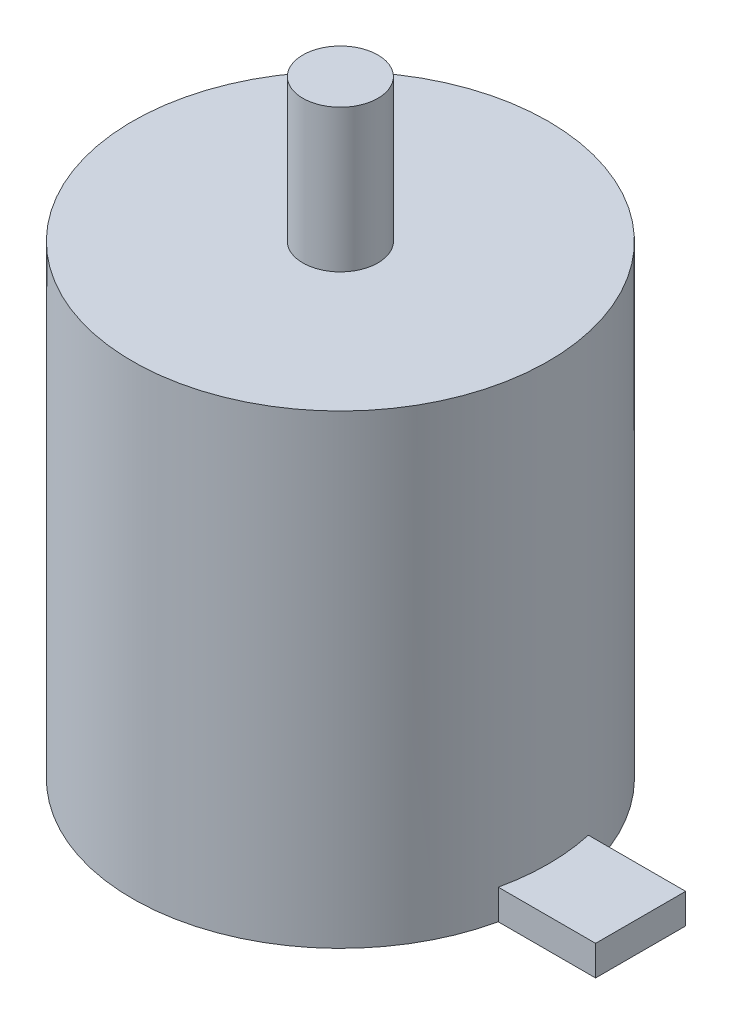
ISO-10303-21;
HEADER;
FILE_DESCRIPTION(('STEP AP214'),'2;1');
FILE_NAME('part.step','',(''),(''),'','','');
FILE_SCHEMA(('AUTOMOTIVE_DESIGN { 1 0 10303 214 1 1 1 1 }'));
ENDSEC;
DATA;
#1=APPLICATION_CONTEXT('core data for automotive mechanical design processes');
#2=APPLICATION_PROTOCOL_DEFINITION('international standard','automotive_design',2000,#1);
#3=PRODUCT_CONTEXT('',#1,'mechanical');
#4=PRODUCT('Part','Part','',(#3));
#5=PRODUCT_RELATED_PRODUCT_CATEGORY('part','',(#4));
#6=PRODUCT_DEFINITION_FORMATION('','',#4);
#7=PRODUCT_DEFINITION_CONTEXT('part definition',#1,'design');
#8=PRODUCT_DEFINITION('design','',#6,#7);
#9=PRODUCT_DEFINITION_SHAPE('','',#8);
#10=(LENGTH_UNIT() NAMED_UNIT(*) SI_UNIT(.MILLI.,.METRE.));
#11=(NAMED_UNIT(*) PLANE_ANGLE_UNIT() SI_UNIT($,.RADIAN.));
#12=(NAMED_UNIT(*) SI_UNIT($,.STERADIAN.) SOLID_ANGLE_UNIT());
#13=UNCERTAINTY_MEASURE_WITH_UNIT(LENGTH_MEASURE(1.E-05),#10,'distance_accuracy_value','');
#14=(GEOMETRIC_REPRESENTATION_CONTEXT(3) GLOBAL_UNCERTAINTY_ASSIGNED_CONTEXT((#13)) GLOBAL_UNIT_ASSIGNED_CONTEXT((#10,
#11,#12)) REPRESENTATION_CONTEXT('',''));
#15=CARTESIAN_POINT('',(0.,0.,0.));
#16=DIRECTION('',(0.,0.,1.));
#17=DIRECTION('',(1.,0.,0.));
#18=AXIS2_PLACEMENT_3D('',#15,#16,#17);
#19=CARTESIAN_POINT('',(0.,-2.,0.));
#20=DIRECTION('',(0.,-1.,0.));
#21=DIRECTION('',(0.,0.,-1.));
#22=AXIS2_PLACEMENT_3D('',#19,#20,#21);
#23=PLANE('',#22);
#24=CARTESIAN_POINT('',(0.,-2.,0.));
#25=DIRECTION('',(0.,-1.,0.));
#26=DIRECTION('',(0.,0.,-1.));
#27=AXIS2_PLACEMENT_3D('',#24,#25,#26);
#28=CIRCLE('',#27,1.5);
#29=CARTESIAN_POINT('',(0.,-2.,-1.5));
#30=VERTEX_POINT('',#29);
#31=EDGE_CURVE('E11',#30,#30,#28,.T.);
#32=ORIENTED_EDGE('',*,*,#31,.T.);
#33=EDGE_LOOP('',(#32));
#34=FACE_BOUND('',#33,.T.);
#35=ADVANCED_FACE('F45',(#34),#23,.T.);
#36=CARTESIAN_POINT('',(0.,0.,0.));
#37=DIRECTION('',(0.,-1.,0.));
#38=DIRECTION('',(0.,0.,-1.));
#39=AXIS2_PLACEMENT_3D('',#36,#37,#38);
#40=CYLINDRICAL_SURFACE('',#39,1.5);
#41=CARTESIAN_POINT('',(0.,0.,0.));
#42=DIRECTION('',(0.,-1.,0.));
#43=DIRECTION('',(0.,0.,-1.));
#44=AXIS2_PLACEMENT_3D('',#41,#42,#43);
#45=CIRCLE('',#44,1.5);
#46=CARTESIAN_POINT('',(0.,0.,-1.5));
#47=VERTEX_POINT('',#46);
#48=EDGE_CURVE('E53',#47,#47,#45,.T.);
#49=ORIENTED_EDGE('',*,*,#48,.T.);
#50=EDGE_LOOP('',(#49));
#51=FACE_BOUND('',#50,.T.);
#52=ORIENTED_EDGE('',*,*,#31,.F.);
#53=EDGE_LOOP('',(#52));
#54=FACE_BOUND('',#53,.T.);
#55=ADVANCED_FACE('F182',(#51,#54),#40,.T.);
#56=CARTESIAN_POINT('',(0.,0.,-1.5));
#57=DIRECTION('',(0.,-1.,0.));
#58=DIRECTION('',(0.,0.,-1.));
#59=AXIS2_PLACEMENT_3D('',#56,#57,#58);
#60=PLANE('',#59);
#61=CARTESIAN_POINT('',(6.7175144212722,0.,-6.7175144212722));
#62=DIRECTION('',(0.,-1.,0.));
#63=DIRECTION('',(0.,0.,-1.));
#64=AXIS2_PLACEMENT_3D('',#61,#62,#63);
#65=CIRCLE('',#64,1.25);
#66=CARTESIAN_POINT('',(6.7175144212722,0.,-7.9675144212722));
#67=VERTEX_POINT('',#66);
#68=EDGE_CURVE('E141',#67,#67,#65,.T.);
#69=ORIENTED_EDGE('',*,*,#68,.F.);
#70=EDGE_LOOP('',(#69));
#71=FACE_BOUND('',#70,.T.);
#72=CARTESIAN_POINT('',(-6.7175144212722,0.,6.7175144212722));
#73=DIRECTION('',(0.,-1.,0.));
#74=DIRECTION('',(0.,0.,1.));
#75=AXIS2_PLACEMENT_3D('',#72,#73,#74);
#76=CIRCLE('',#75,1.25);
#77=CARTESIAN_POINT('',(-6.7175144212722,0.,7.9675144212722));
#78=VERTEX_POINT('',#77);
#79=EDGE_CURVE('E150',#78,#78,#76,.T.);
#80=ORIENTED_EDGE('',*,*,#79,.F.);
#81=EDGE_LOOP('',(#80));
#82=FACE_BOUND('',#81,.T.);
#83=CARTESIAN_POINT('',(-5.65685424974619,0.,-5.65685424974618));
#84=DIRECTION('',(0.,-1.,0.));
#85=DIRECTION('',(0.,0.,1.));
#86=AXIS2_PLACEMENT_3D('',#83,#84,#85);
#87=CIRCLE('',#86,1.25);
#88=CARTESIAN_POINT('',(-5.65685424974619,0.,-4.40685424974618));
#89=VERTEX_POINT('',#88);
#90=EDGE_CURVE('E133',#89,#89,#87,.T.);
#91=ORIENTED_EDGE('',*,*,#90,.F.);
#92=EDGE_LOOP('',(#91));
#93=FACE_BOUND('',#92,.T.);
#94=CARTESIAN_POINT('',(5.65685424974619,0.,5.65685424974619));
#95=DIRECTION('',(0.,-1.,0.));
#96=DIRECTION('',(0.,0.,-1.));
#97=AXIS2_PLACEMENT_3D('',#94,#95,#96);
#98=CIRCLE('',#97,1.25);
#99=CARTESIAN_POINT('',(5.65685424974619,0.,4.40685424974619));
#100=VERTEX_POINT('',#99);
#101=EDGE_CURVE('E145',#100,#100,#98,.T.);
#102=ORIENTED_EDGE('',*,*,#101,.F.);
#103=EDGE_LOOP('',(#102));
#104=FACE_BOUND('',#103,.T.);
#105=CARTESIAN_POINT('',(0.,0.,0.));
#106=DIRECTION('',(0.,-1.,0.));
#107=DIRECTION('',(0.,0.,-1.));
#108=AXIS2_PLACEMENT_3D('',#105,#106,#107);
#109=CIRCLE('',#108,13.85);
#110=CARTESIAN_POINT('',(13.5211870780638,0.,3.));
#111=VERTEX_POINT('',#110);
#112=CARTESIAN_POINT('',(13.5211870780638,0.,-3.));
#113=VERTEX_POINT('',#112);
#114=EDGE_CURVE('E176',#111,#113,#109,.T.);
#115=ORIENTED_EDGE('',*,*,#114,.T.);
#116=DIRECTION('',(1.,0.,0.));
#117=VECTOR('',#116,1.);
#118=CARTESIAN_POINT('',(0.,0.,-3.));
#119=LINE('',#118,#117);
#120=CARTESIAN_POINT('',(20.,0.,-3.));
#121=VERTEX_POINT('',#120);
#122=EDGE_CURVE('E84',#113,#121,#119,.T.);
#123=ORIENTED_EDGE('',*,*,#122,.T.);
#124=DIRECTION('',(0.,0.,1.));
#125=VECTOR('',#124,1.);
#126=CARTESIAN_POINT('',(20.,0.,0.));
#127=LINE('',#126,#125);
#128=CARTESIAN_POINT('',(20.,0.,3.));
#129=VERTEX_POINT('',#128);
#130=EDGE_CURVE('E121',#121,#129,#127,.T.);
#131=ORIENTED_EDGE('',*,*,#130,.T.);
#132=DIRECTION('',(1.,0.,0.));
#133=VECTOR('',#132,1.);
#134=CARTESIAN_POINT('',(0.,0.,3.));
#135=LINE('',#134,#133);
#136=EDGE_CURVE('E60',#111,#129,#135,.T.);
#137=ORIENTED_EDGE('',*,*,#136,.F.);
#138=EDGE_LOOP('',(#115,#123,#131,#137));
#139=FACE_BOUND('',#138,.T.);
#140=ORIENTED_EDGE('',*,*,#48,.F.);
#141=EDGE_LOOP('',(#140));
#142=FACE_BOUND('',#141,.T.);
#143=ADVANCED_FACE('F185',(#71,#82,#93,#104,#139,#142),#60,.T.);
#144=CARTESIAN_POINT('',(0.,0.,0.));
#145=DIRECTION('',(0.,-1.,0.));
#146=DIRECTION('',(0.,0.,-1.));
#147=AXIS2_PLACEMENT_3D('',#144,#145,#146);
#148=CYLINDRICAL_SURFACE('',#147,13.85);
#149=DIRECTION('',(0.,-1.,0.));
#150=VECTOR('',#149,1.);
#151=CARTESIAN_POINT('',(13.5211870780638,2.,-3.));
#152=LINE('',#151,#150);
#153=CARTESIAN_POINT('',(13.5211870780638,2.,-3.));
#154=VERTEX_POINT('',#153);
#155=EDGE_CURVE('E69',#154,#113,#152,.T.);
#156=ORIENTED_EDGE('',*,*,#155,.T.);
#157=ORIENTED_EDGE('',*,*,#114,.F.);
#158=DIRECTION('',(0.,-1.,0.));
#159=VECTOR('',#158,1.);
#160=CARTESIAN_POINT('',(13.5211870780638,2.,3.));
#161=LINE('',#160,#159);
#162=CARTESIAN_POINT('',(13.5211870780638,2.,3.));
#163=VERTEX_POINT('',#162);
#164=EDGE_CURVE('E108',#163,#111,#161,.T.);
#165=ORIENTED_EDGE('',*,*,#164,.F.);
#166=CARTESIAN_POINT('',(0.,2.,0.));
#167=DIRECTION('',(0.,-1.,0.));
#168=DIRECTION('',(0.,0.,-1.));
#169=AXIS2_PLACEMENT_3D('',#166,#167,#168);
#170=CIRCLE('',#169,13.85);
#171=EDGE_CURVE('E100',#154,#163,#170,.T.);
#172=ORIENTED_EDGE('',*,*,#171,.F.);
#173=EDGE_LOOP('',(#156,#157,#165,#172));
#174=FACE_BOUND('',#173,.T.);
#175=CARTESIAN_POINT('',(0.,31.,0.));
#176=DIRECTION('',(0.,-1.,0.));
#177=DIRECTION('',(0.,0.,-1.));
#178=AXIS2_PLACEMENT_3D('',#175,#176,#177);
#179=CIRCLE('',#178,13.85);
#180=CARTESIAN_POINT('',(0.,31.,-13.85));
#181=VERTEX_POINT('',#180);
#182=EDGE_CURVE('E172',#181,#181,#179,.T.);
#183=ORIENTED_EDGE('',*,*,#182,.T.);
#184=EDGE_LOOP('',(#183));
#185=FACE_BOUND('',#184,.T.);
#186=ADVANCED_FACE('F187',(#174,#185),#148,.T.);
#187=CARTESIAN_POINT('',(0.,31.,-2.5));
#188=DIRECTION('',(0.,1.,0.));
#189=DIRECTION('',(0.,0.,1.));
#190=AXIS2_PLACEMENT_3D('',#187,#188,#189);
#191=PLANE('',#190);
#192=CARTESIAN_POINT('',(0.,31.,0.));
#193=DIRECTION('',(0.,-1.,0.));
#194=DIRECTION('',(0.,0.,-1.));
#195=AXIS2_PLACEMENT_3D('',#192,#193,#194);
#196=CIRCLE('',#195,2.5);
#197=CARTESIAN_POINT('',(0.,31.,-2.5));
#198=VERTEX_POINT('',#197);
#199=EDGE_CURVE('E168',#198,#198,#196,.T.);
#200=ORIENTED_EDGE('',*,*,#199,.T.);
#201=EDGE_LOOP('',(#200));
#202=FACE_BOUND('',#201,.T.);
#203=ORIENTED_EDGE('',*,*,#182,.F.);
#204=EDGE_LOOP('',(#203));
#205=FACE_BOUND('',#204,.T.);
#206=ADVANCED_FACE('F195',(#202,#205),#191,.T.);
#207=CARTESIAN_POINT('',(0.,0.,0.));
#208=DIRECTION('',(0.,-1.,0.));
#209=DIRECTION('',(0.,0.,-1.));
#210=AXIS2_PLACEMENT_3D('',#207,#208,#209);
#211=CYLINDRICAL_SURFACE('',#210,2.5);
#212=CARTESIAN_POINT('',(0.,40.5,0.));
#213=DIRECTION('',(0.,-1.,0.));
#214=DIRECTION('',(0.,0.,-1.));
#215=AXIS2_PLACEMENT_3D('',#212,#213,#214);
#216=CIRCLE('',#215,2.5);
#217=CARTESIAN_POINT('',(0.,40.5,-2.5));
#218=VERTEX_POINT('',#217);
#219=EDGE_CURVE('E161',#218,#218,#216,.T.);
#220=ORIENTED_EDGE('',*,*,#219,.T.);
#221=EDGE_LOOP('',(#220));
#222=FACE_BOUND('',#221,.T.);
#223=ORIENTED_EDGE('',*,*,#199,.F.);
#224=EDGE_LOOP('',(#223));
#225=FACE_BOUND('',#224,.T.);
#226=ADVANCED_FACE('F226',(#222,#225),#211,.T.);
#227=CARTESIAN_POINT('',(0.,40.5,0.));
#228=DIRECTION('',(0.,1.,0.));
#229=DIRECTION('',(0.,0.,1.));
#230=AXIS2_PLACEMENT_3D('',#227,#228,#229);
#231=PLANE('',#230);
#232=ORIENTED_EDGE('',*,*,#219,.F.);
#233=EDGE_LOOP('',(#232));
#234=FACE_BOUND('',#233,.T.);
#235=ADVANCED_FACE('F233',(#234),#231,.T.);
#236=CARTESIAN_POINT('',(5.65685424974619,5.,5.65685424974619));
#237=DIRECTION('',(0.,-1.,0.));
#238=DIRECTION('',(0.,0.,-1.));
#239=AXIS2_PLACEMENT_3D('',#236,#237,#238);
#240=CYLINDRICAL_SURFACE('',#239,1.25);
#241=CARTESIAN_POINT('',(5.65685424974619,5.,5.65685424974619));
#242=DIRECTION('',(0.,-1.,0.));
#243=DIRECTION('',(0.,0.,-1.));
#244=AXIS2_PLACEMENT_3D('',#241,#242,#243);
#245=CIRCLE('',#244,1.25);
#246=CARTESIAN_POINT('',(5.65685424974619,5.,4.40685424974619));
#247=VERTEX_POINT('',#246);
#248=EDGE_CURVE('E157',#247,#247,#245,.T.);
#249=ORIENTED_EDGE('',*,*,#248,.F.);
#250=EDGE_LOOP('',(#249));
#251=FACE_BOUND('',#250,.T.);
#252=ORIENTED_EDGE('',*,*,#101,.T.);
#253=EDGE_LOOP('',(#252));
#254=FACE_BOUND('',#253,.T.);
#255=ADVANCED_FACE('F241',(#251,#254),#240,.F.);
#256=CARTESIAN_POINT('',(5.65685424974619,5.,5.65685424974619));
#257=DIRECTION('',(0.,-1.,0.));
#258=DIRECTION('',(0.,0.,-1.));
#259=AXIS2_PLACEMENT_3D('',#256,#257,#258);
#260=PLANE('',#259);
#261=ORIENTED_EDGE('',*,*,#248,.T.);
#262=EDGE_LOOP('',(#261));
#263=FACE_BOUND('',#262,.T.);
#264=ADVANCED_FACE('F249',(#263),#260,.T.);
#265=CARTESIAN_POINT('',(-5.65685424974619,5.,-5.65685424974618));
#266=DIRECTION('',(0.,-1.,0.));
#267=DIRECTION('',(0.,0.,-1.));
#268=AXIS2_PLACEMENT_3D('',#265,#266,#267);
#269=CYLINDRICAL_SURFACE('',#268,1.25);
#270=CARTESIAN_POINT('',(-5.65685424974619,5.,-5.65685424974618));
#271=DIRECTION('',(0.,-1.,0.));
#272=DIRECTION('',(0.,0.,1.));
#273=AXIS2_PLACEMENT_3D('',#270,#271,#272);
#274=CIRCLE('',#273,1.25);
#275=CARTESIAN_POINT('',(-5.65685424974619,5.,-4.40685424974618));
#276=VERTEX_POINT('',#275);
#277=EDGE_CURVE('E128',#276,#276,#274,.T.);
#278=ORIENTED_EDGE('',*,*,#277,.F.);
#279=EDGE_LOOP('',(#278));
#280=FACE_BOUND('',#279,.T.);
#281=ORIENTED_EDGE('',*,*,#90,.T.);
#282=EDGE_LOOP('',(#281));
#283=FACE_BOUND('',#282,.T.);
#284=ADVANCED_FACE('F257',(#280,#283),#269,.F.);
#285=CARTESIAN_POINT('',(-5.65685424974619,5.,-5.65685424974618));
#286=DIRECTION('',(0.,1.,0.));
#287=DIRECTION('',(0.,0.,1.));
#288=AXIS2_PLACEMENT_3D('',#285,#286,#287);
#289=PLANE('',#288);
#290=ORIENTED_EDGE('',*,*,#277,.T.);
#291=EDGE_LOOP('',(#290));
#292=FACE_BOUND('',#291,.T.);
#293=ADVANCED_FACE('F265',(#292),#289,.F.);
#294=CARTESIAN_POINT('',(-6.7175144212722,5.,6.7175144212722));
#295=DIRECTION('',(0.,-1.,0.));
#296=DIRECTION('',(0.,0.,-1.));
#297=AXIS2_PLACEMENT_3D('',#294,#295,#296);
#298=CYLINDRICAL_SURFACE('',#297,1.25);
#299=CARTESIAN_POINT('',(-6.7175144212722,5.,6.7175144212722));
#300=DIRECTION('',(0.,-1.,0.));
#301=DIRECTION('',(0.,0.,1.));
#302=AXIS2_PLACEMENT_3D('',#299,#300,#301);
#303=CIRCLE('',#302,1.25);
#304=CARTESIAN_POINT('',(-6.7175144212722,5.,7.9675144212722));
#305=VERTEX_POINT('',#304);
#306=EDGE_CURVE('E137',#305,#305,#303,.T.);
#307=ORIENTED_EDGE('',*,*,#306,.F.);
#308=EDGE_LOOP('',(#307));
#309=FACE_BOUND('',#308,.T.);
#310=ORIENTED_EDGE('',*,*,#79,.T.);
#311=EDGE_LOOP('',(#310));
#312=FACE_BOUND('',#311,.T.);
#313=ADVANCED_FACE('F273',(#309,#312),#298,.F.);
#314=CARTESIAN_POINT('',(-6.7175144212722,5.,6.7175144212722));
#315=DIRECTION('',(0.,1.,0.));
#316=DIRECTION('',(0.,0.,1.));
#317=AXIS2_PLACEMENT_3D('',#314,#315,#316);
#318=PLANE('',#317);
#319=ORIENTED_EDGE('',*,*,#306,.T.);
#320=EDGE_LOOP('',(#319));
#321=FACE_BOUND('',#320,.T.);
#322=ADVANCED_FACE('F281',(#321),#318,.F.);
#323=CARTESIAN_POINT('',(6.7175144212722,5.,-6.7175144212722));
#324=DIRECTION('',(0.,-1.,0.));
#325=DIRECTION('',(0.,0.,-1.));
#326=AXIS2_PLACEMENT_3D('',#323,#324,#325);
#327=CYLINDRICAL_SURFACE('',#326,1.25);
#328=CARTESIAN_POINT('',(6.7175144212722,5.,-6.7175144212722));
#329=DIRECTION('',(0.,-1.,0.));
#330=DIRECTION('',(0.,0.,-1.));
#331=AXIS2_PLACEMENT_3D('',#328,#329,#330);
#332=CIRCLE('',#331,1.25);
#333=CARTESIAN_POINT('',(6.7175144212722,5.,-7.9675144212722));
#334=VERTEX_POINT('',#333);
#335=EDGE_CURVE('E146',#334,#334,#332,.T.);
#336=ORIENTED_EDGE('',*,*,#335,.F.);
#337=EDGE_LOOP('',(#336));
#338=FACE_BOUND('',#337,.T.);
#339=ORIENTED_EDGE('',*,*,#68,.T.);
#340=EDGE_LOOP('',(#339));
#341=FACE_BOUND('',#340,.T.);
#342=ADVANCED_FACE('F289',(#338,#341),#327,.F.);
#343=CARTESIAN_POINT('',(6.7175144212722,5.,-6.7175144212722));
#344=DIRECTION('',(0.,-1.,0.));
#345=DIRECTION('',(0.,0.,-1.));
#346=AXIS2_PLACEMENT_3D('',#343,#344,#345);
#347=PLANE('',#346);
#348=ORIENTED_EDGE('',*,*,#335,.T.);
#349=EDGE_LOOP('',(#348));
#350=FACE_BOUND('',#349,.T.);
#351=ADVANCED_FACE('F296',(#350),#347,.T.);
#352=CARTESIAN_POINT('',(0.,2.,-3.));
#353=DIRECTION('',(0.,0.,-1.));
#354=DIRECTION('',(-1.,0.,0.));
#355=AXIS2_PLACEMENT_3D('',#352,#353,#354);
#356=PLANE('',#355);
#357=ORIENTED_EDGE('',*,*,#122,.F.);
#358=ORIENTED_EDGE('',*,*,#155,.F.);
#359=DIRECTION('',(1.,0.,0.));
#360=VECTOR('',#359,1.);
#361=CARTESIAN_POINT('',(0.,2.,-3.));
#362=LINE('',#361,#360);
#363=CARTESIAN_POINT('',(20.,2.,-3.));
#364=VERTEX_POINT('',#363);
#365=EDGE_CURVE('E112',#154,#364,#362,.T.);
#366=ORIENTED_EDGE('',*,*,#365,.T.);
#367=DIRECTION('',(0.,-1.,0.));
#368=VECTOR('',#367,1.);
#369=CARTESIAN_POINT('',(20.,2.,-3.));
#370=LINE('',#369,#368);
#371=EDGE_CURVE('E90',#364,#121,#370,.T.);
#372=ORIENTED_EDGE('',*,*,#371,.T.);
#373=EDGE_LOOP('',(#357,#358,#366,#372));
#374=FACE_BOUND('',#373,.T.);
#375=ADVANCED_FACE('F303',(#374),#356,.T.);
#376=CARTESIAN_POINT('',(0.,2.,3.));
#377=DIRECTION('',(0.,0.,-1.));
#378=DIRECTION('',(-1.,0.,0.));
#379=AXIS2_PLACEMENT_3D('',#376,#377,#378);
#380=PLANE('',#379);
#381=ORIENTED_EDGE('',*,*,#136,.T.);
#382=DIRECTION('',(0.,-1.,0.));
#383=VECTOR('',#382,1.);
#384=CARTESIAN_POINT('',(20.,2.,3.));
#385=LINE('',#384,#383);
#386=CARTESIAN_POINT('',(20.,2.,3.));
#387=VERTEX_POINT('',#386);
#388=EDGE_CURVE('E105',#387,#129,#385,.T.);
#389=ORIENTED_EDGE('',*,*,#388,.F.);
#390=DIRECTION('',(1.,0.,0.));
#391=VECTOR('',#390,1.);
#392=CARTESIAN_POINT('',(0.,2.,3.));
#393=LINE('',#392,#391);
#394=EDGE_CURVE('E95',#163,#387,#393,.T.);
#395=ORIENTED_EDGE('',*,*,#394,.F.);
#396=ORIENTED_EDGE('',*,*,#164,.T.);
#397=EDGE_LOOP('',(#381,#389,#395,#396));
#398=FACE_BOUND('',#397,.T.);
#399=ADVANCED_FACE('F106',(#398),#380,.F.);
#400=CARTESIAN_POINT('',(20.,2.,0.));
#401=DIRECTION('',(1.,0.,0.));
#402=DIRECTION('',(0.,0.,-1.));
#403=AXIS2_PLACEMENT_3D('',#400,#401,#402);
#404=PLANE('',#403);
#405=ORIENTED_EDGE('',*,*,#130,.F.);
#406=ORIENTED_EDGE('',*,*,#371,.F.);
#407=DIRECTION('',(0.,0.,1.));
#408=VECTOR('',#407,1.);
#409=CARTESIAN_POINT('',(20.,2.,0.));
#410=LINE('',#409,#408);
#411=EDGE_CURVE('E98',#364,#387,#410,.T.);
#412=ORIENTED_EDGE('',*,*,#411,.T.);
#413=ORIENTED_EDGE('',*,*,#388,.T.);
#414=EDGE_LOOP('',(#405,#406,#412,#413));
#415=FACE_BOUND('',#414,.T.);
#416=ADVANCED_FACE('F110',(#415),#404,.T.);
#417=CARTESIAN_POINT('',(0.,2.,0.));
#418=DIRECTION('',(0.,-1.,0.));
#419=DIRECTION('',(0.,0.,-1.));
#420=AXIS2_PLACEMENT_3D('',#417,#418,#419);
#421=PLANE('',#420);
#422=ORIENTED_EDGE('',*,*,#365,.F.);
#423=ORIENTED_EDGE('',*,*,#171,.T.);
#424=ORIENTED_EDGE('',*,*,#394,.T.);
#425=ORIENTED_EDGE('',*,*,#411,.F.);
#426=EDGE_LOOP('',(#422,#423,#424,#425));
#427=FACE_BOUND('',#426,.T.);
#428=ADVANCED_FACE('F97',(#427),#421,.F.);
#429=CLOSED_SHELL('',(#35,#55,#143,#186,#206,#226,#235,#255,#264,#284,#293,#313,#322,#342,#351,
#375,#399,#416,#428));
#430=MANIFOLD_SOLID_BREP('B2',#429);
#431=ADVANCED_BREP_SHAPE_REPRESENTATION('',(#18,#430),#14);
#432=SHAPE_DEFINITION_REPRESENTATION(#9,#431);
ENDSEC;
END-ISO-10303-21;
